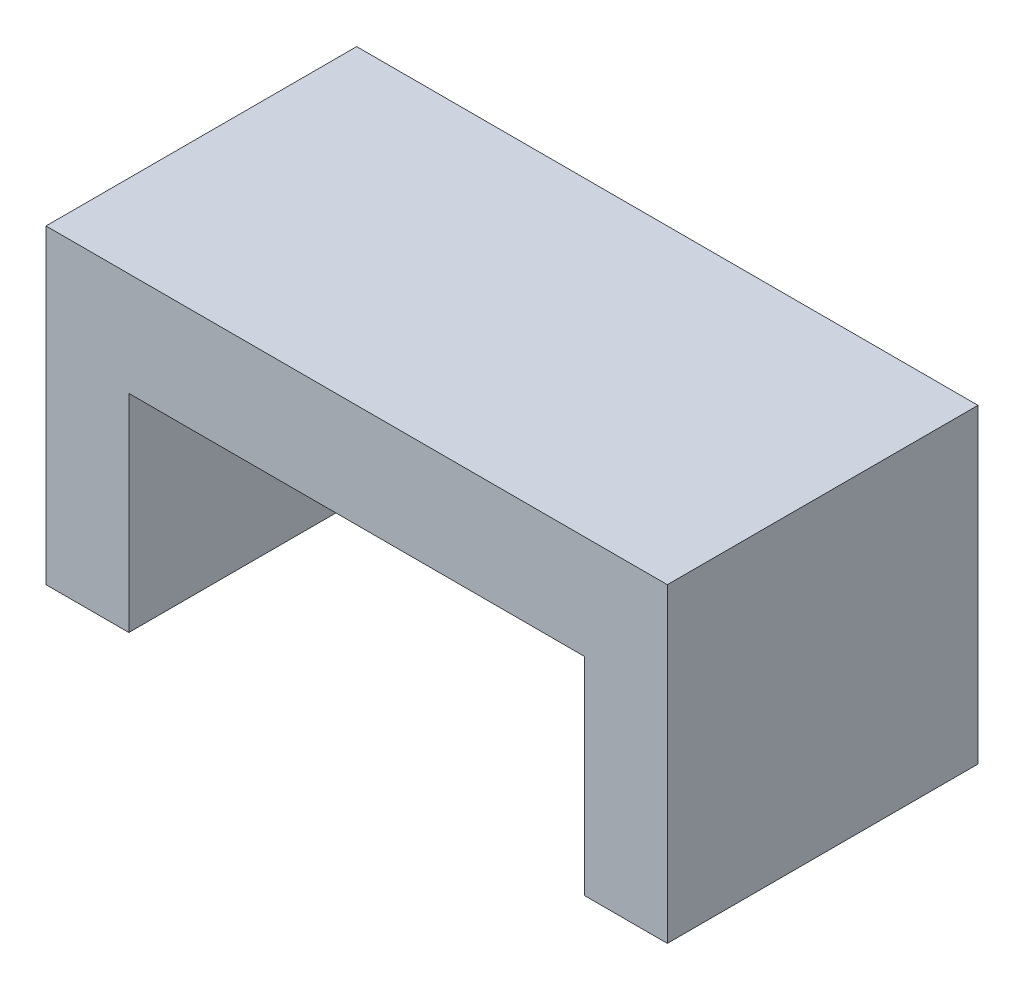
ISO-10303-21;
HEADER;
FILE_DESCRIPTION(('STEP AP214'),'2;1');
FILE_NAME('part.step','',(''),(''),'','','');
FILE_SCHEMA(('AUTOMOTIVE_DESIGN { 1 0 10303 214 1 1 1 1 }'));
ENDSEC;
DATA;
#1=APPLICATION_CONTEXT('core data for automotive mechanical design processes');
#2=APPLICATION_PROTOCOL_DEFINITION('international standard','automotive_design',2000,#1);
#3=PRODUCT_CONTEXT('',#1,'mechanical');
#4=PRODUCT('Part','Part','',(#3));
#5=PRODUCT_RELATED_PRODUCT_CATEGORY('part','',(#4));
#6=PRODUCT_DEFINITION_FORMATION('','',#4);
#7=PRODUCT_DEFINITION_CONTEXT('part definition',#1,'design');
#8=PRODUCT_DEFINITION('design','',#6,#7);
#9=PRODUCT_DEFINITION_SHAPE('','',#8);
#10=(LENGTH_UNIT() NAMED_UNIT(*) SI_UNIT(.MILLI.,.METRE.));
#11=(NAMED_UNIT(*) PLANE_ANGLE_UNIT() SI_UNIT($,.RADIAN.));
#12=(NAMED_UNIT(*) SI_UNIT($,.STERADIAN.) SOLID_ANGLE_UNIT());
#13=UNCERTAINTY_MEASURE_WITH_UNIT(LENGTH_MEASURE(1.E-05),#10,'distance_accuracy_value','');
#14=(GEOMETRIC_REPRESENTATION_CONTEXT(3) GLOBAL_UNCERTAINTY_ASSIGNED_CONTEXT((#13)) GLOBAL_UNIT_ASSIGNED_CONTEXT((#10,
#11,#12)) REPRESENTATION_CONTEXT('',''));
#15=CARTESIAN_POINT('',(0.,0.,0.));
#16=DIRECTION('',(0.,0.,1.));
#17=DIRECTION('',(1.,0.,0.));
#18=AXIS2_PLACEMENT_3D('',#15,#16,#17);
#19=CARTESIAN_POINT('',(11.,-10.,7.5));
#20=DIRECTION('',(-1.,0.,0.));
#21=DIRECTION('',(0.,0.,1.));
#22=AXIS2_PLACEMENT_3D('',#19,#20,#21);
#23=PLANE('',#22);
#24=DIRECTION('',(0.,0.,1.));
#25=VECTOR('',#24,1.);
#26=CARTESIAN_POINT('',(11.,0.,7.5));
#27=LINE('',#26,#25);
#28=CARTESIAN_POINT('',(11.,0.,-7.5));
#29=VERTEX_POINT('',#28);
#30=CARTESIAN_POINT('',(11.,0.,7.5));
#31=VERTEX_POINT('',#30);
#32=EDGE_CURVE('E110',#29,#31,#27,.T.);
#33=ORIENTED_EDGE('',*,*,#32,.F.);
#34=DIRECTION('',(0.,1.,0.));
#35=VECTOR('',#34,1.);
#36=CARTESIAN_POINT('',(11.,-10.,-7.5));
#37=LINE('',#36,#35);
#38=CARTESIAN_POINT('',(11.,-10.,-7.5));
#39=VERTEX_POINT('',#38);
#40=EDGE_CURVE('E11',#39,#29,#37,.T.);
#41=ORIENTED_EDGE('',*,*,#40,.F.);
#42=DIRECTION('',(0.,0.,1.));
#43=VECTOR('',#42,1.);
#44=CARTESIAN_POINT('',(11.,-10.,7.5));
#45=LINE('',#44,#43);
#46=CARTESIAN_POINT('',(11.,-10.,7.5));
#47=VERTEX_POINT('',#46);
#48=EDGE_CURVE('E108',#39,#47,#45,.T.);
#49=ORIENTED_EDGE('',*,*,#48,.T.);
#50=DIRECTION('',(0.,1.,0.));
#51=VECTOR('',#50,1.);
#52=CARTESIAN_POINT('',(11.,-10.,7.5));
#53=LINE('',#52,#51);
#54=EDGE_CURVE('E36',#47,#31,#53,.T.);
#55=ORIENTED_EDGE('',*,*,#54,.T.);
#56=EDGE_LOOP('',(#33,#41,#49,#55));
#57=FACE_BOUND('',#56,.T.);
#58=ADVANCED_FACE('F33',(#57),#23,.T.);
#59=CARTESIAN_POINT('',(11.,-10.,-7.5));
#60=DIRECTION('',(0.,0.,-1.));
#61=DIRECTION('',(-1.,0.,0.));
#62=AXIS2_PLACEMENT_3D('',#59,#60,#61);
#63=PLANE('',#62);
#64=ORIENTED_EDGE('',*,*,#40,.T.);
#65=DIRECTION('',(1.,0.,0.));
#66=VECTOR('',#65,1.);
#67=CARTESIAN_POINT('',(-15.,0.,-7.5));
#68=LINE('',#67,#66);
#69=CARTESIAN_POINT('',(-11.,0.,-7.5));
#70=VERTEX_POINT('',#69);
#71=EDGE_CURVE('E69',#70,#29,#68,.T.);
#72=ORIENTED_EDGE('',*,*,#71,.F.);
#73=DIRECTION('',(0.,1.,0.));
#74=VECTOR('',#73,1.);
#75=CARTESIAN_POINT('',(-11.,-10.,-7.5));
#76=LINE('',#75,#74);
#77=CARTESIAN_POINT('',(-11.,-10.,-7.5));
#78=VERTEX_POINT('',#77);
#79=EDGE_CURVE('E148',#78,#70,#76,.T.);
#80=ORIENTED_EDGE('',*,*,#79,.F.);
#81=DIRECTION('',(-1.,0.,0.));
#82=VECTOR('',#81,1.);
#83=CARTESIAN_POINT('',(-11.,-10.,-7.5));
#84=LINE('',#83,#82);
#85=CARTESIAN_POINT('',(-15.,-10.,-7.49999999999999));
#86=VERTEX_POINT('',#85);
#87=EDGE_CURVE('E161',#78,#86,#84,.T.);
#88=ORIENTED_EDGE('',*,*,#87,.T.);
#89=DIRECTION('',(0.,-1.,0.));
#90=VECTOR('',#89,1.);
#91=CARTESIAN_POINT('',(-15.,0.,-7.5));
#92=LINE('',#91,#90);
#93=CARTESIAN_POINT('',(-15.,5.,-7.5));
#94=VERTEX_POINT('',#93);
#95=EDGE_CURVE('E130',#94,#86,#92,.T.);
#96=ORIENTED_EDGE('',*,*,#95,.F.);
#97=DIRECTION('',(-1.,0.,0.));
#98=VECTOR('',#97,1.);
#99=CARTESIAN_POINT('',(-15.,5.,-7.5));
#100=LINE('',#99,#98);
#101=CARTESIAN_POINT('',(15.,5.,-7.5));
#102=VERTEX_POINT('',#101);
#103=EDGE_CURVE('E124',#102,#94,#100,.T.);
#104=ORIENTED_EDGE('',*,*,#103,.F.);
#105=DIRECTION('',(0.,1.,0.));
#106=VECTOR('',#105,1.);
#107=CARTESIAN_POINT('',(15.,-10.,-7.49999999999999));
#108=LINE('',#107,#106);
#109=CARTESIAN_POINT('',(15.,-10.,-7.49999999999999));
#110=VERTEX_POINT('',#109);
#111=EDGE_CURVE('E41',#110,#102,#108,.T.);
#112=ORIENTED_EDGE('',*,*,#111,.F.);
#113=DIRECTION('',(-1.,0.,0.));
#114=VECTOR('',#113,1.);
#115=CARTESIAN_POINT('',(11.,-10.,-7.5));
#116=LINE('',#115,#114);
#117=EDGE_CURVE('E105',#110,#39,#116,.T.);
#118=ORIENTED_EDGE('',*,*,#117,.T.);
#119=EDGE_LOOP('',(#64,#72,#80,#88,#96,#104,#112,#118));
#120=FACE_BOUND('',#119,.T.);
#121=ADVANCED_FACE('F127',(#120),#63,.T.);
#122=CARTESIAN_POINT('',(15.,-10.,7.5));
#123=DIRECTION('',(1.,0.,0.));
#124=DIRECTION('',(0.,0.,-1.));
#125=AXIS2_PLACEMENT_3D('',#122,#123,#124);
#126=PLANE('',#125);
#127=ORIENTED_EDGE('',*,*,#111,.T.);
#128=DIRECTION('',(0.,0.,1.));
#129=VECTOR('',#128,1.);
#130=CARTESIAN_POINT('',(15.,5.,-7.5));
#131=LINE('',#130,#129);
#132=CARTESIAN_POINT('',(15.,5.,7.5));
#133=VERTEX_POINT('',#132);
#134=EDGE_CURVE('E96',#102,#133,#131,.T.);
#135=ORIENTED_EDGE('',*,*,#134,.T.);
#136=DIRECTION('',(0.,1.,0.));
#137=VECTOR('',#136,1.);
#138=CARTESIAN_POINT('',(15.,-10.,7.5));
#139=LINE('',#138,#137);
#140=CARTESIAN_POINT('',(15.,-10.,7.5));
#141=VERTEX_POINT('',#140);
#142=EDGE_CURVE('E88',#141,#133,#139,.T.);
#143=ORIENTED_EDGE('',*,*,#142,.F.);
#144=DIRECTION('',(0.,0.,-1.));
#145=VECTOR('',#144,1.);
#146=CARTESIAN_POINT('',(15.,-10.,7.5));
#147=LINE('',#146,#145);
#148=EDGE_CURVE('E92',#141,#110,#147,.T.);
#149=ORIENTED_EDGE('',*,*,#148,.T.);
#150=EDGE_LOOP('',(#127,#135,#143,#149));
#151=FACE_BOUND('',#150,.T.);
#152=ADVANCED_FACE('F91',(#151),#126,.T.);
#153=CARTESIAN_POINT('',(11.,-10.,7.5));
#154=DIRECTION('',(0.,0.,1.));
#155=DIRECTION('',(1.,0.,0.));
#156=AXIS2_PLACEMENT_3D('',#153,#154,#155);
#157=PLANE('',#156);
#158=ORIENTED_EDGE('',*,*,#142,.T.);
#159=DIRECTION('',(-1.,0.,0.));
#160=VECTOR('',#159,1.);
#161=CARTESIAN_POINT('',(-15.,5.,7.5));
#162=LINE('',#161,#160);
#163=CARTESIAN_POINT('',(-15.,5.,7.5));
#164=VERTEX_POINT('',#163);
#165=EDGE_CURVE('E125',#133,#164,#162,.T.);
#166=ORIENTED_EDGE('',*,*,#165,.T.);
#167=DIRECTION('',(0.,-1.,0.));
#168=VECTOR('',#167,1.);
#169=CARTESIAN_POINT('',(-15.,0.,7.5));
#170=LINE('',#169,#168);
#171=CARTESIAN_POINT('',(-15.,-10.,7.5));
#172=VERTEX_POINT('',#171);
#173=EDGE_CURVE('E141',#164,#172,#170,.T.);
#174=ORIENTED_EDGE('',*,*,#173,.T.);
#175=DIRECTION('',(1.,0.,0.));
#176=VECTOR('',#175,1.);
#177=CARTESIAN_POINT('',(-11.,-10.,7.5));
#178=LINE('',#177,#176);
#179=CARTESIAN_POINT('',(-11.,-10.,7.5));
#180=VERTEX_POINT('',#179);
#181=EDGE_CURVE('E162',#172,#180,#178,.T.);
#182=ORIENTED_EDGE('',*,*,#181,.T.);
#183=DIRECTION('',(0.,1.,0.));
#184=VECTOR('',#183,1.);
#185=CARTESIAN_POINT('',(-11.,-10.,7.5));
#186=LINE('',#185,#184);
#187=CARTESIAN_POINT('',(-11.,0.,7.5));
#188=VERTEX_POINT('',#187);
#189=EDGE_CURVE('E151',#180,#188,#186,.T.);
#190=ORIENTED_EDGE('',*,*,#189,.T.);
#191=DIRECTION('',(1.,0.,0.));
#192=VECTOR('',#191,1.);
#193=CARTESIAN_POINT('',(-15.,0.,7.5));
#194=LINE('',#193,#192);
#195=EDGE_CURVE('E77',#188,#31,#194,.T.);
#196=ORIENTED_EDGE('',*,*,#195,.T.);
#197=ORIENTED_EDGE('',*,*,#54,.F.);
#198=DIRECTION('',(1.,0.,0.));
#199=VECTOR('',#198,1.);
#200=CARTESIAN_POINT('',(11.,-10.,7.5));
#201=LINE('',#200,#199);
#202=EDGE_CURVE('E103',#47,#141,#201,.T.);
#203=ORIENTED_EDGE('',*,*,#202,.T.);
#204=EDGE_LOOP('',(#158,#166,#174,#182,#190,#196,#197,#203));
#205=FACE_BOUND('',#204,.T.);
#206=ADVANCED_FACE('F107',(#205),#157,.T.);
#207=CARTESIAN_POINT('',(0.,-10.,0.));
#208=DIRECTION('',(0.,-1.,0.));
#209=DIRECTION('',(0.,0.,-1.));
#210=AXIS2_PLACEMENT_3D('',#207,#208,#209);
#211=PLANE('',#210);
#212=ORIENTED_EDGE('',*,*,#48,.F.);
#213=ORIENTED_EDGE('',*,*,#117,.F.);
#214=ORIENTED_EDGE('',*,*,#148,.F.);
#215=ORIENTED_EDGE('',*,*,#202,.F.);
#216=EDGE_LOOP('',(#212,#213,#214,#215));
#217=FACE_BOUND('',#216,.T.);
#218=ADVANCED_FACE('F102',(#217),#211,.T.);
#219=CARTESIAN_POINT('',(-15.,0.,-7.5));
#220=DIRECTION('',(-1.,0.,0.));
#221=DIRECTION('',(0.,-1.,0.));
#222=AXIS2_PLACEMENT_3D('',#219,#220,#221);
#223=PLANE('',#222);
#224=ORIENTED_EDGE('',*,*,#95,.T.);
#225=DIRECTION('',(0.,0.,1.));
#226=VECTOR('',#225,1.);
#227=CARTESIAN_POINT('',(-15.,-10.,7.5));
#228=LINE('',#227,#226);
#229=EDGE_CURVE('E147',#86,#172,#228,.T.);
#230=ORIENTED_EDGE('',*,*,#229,.T.);
#231=ORIENTED_EDGE('',*,*,#173,.F.);
#232=DIRECTION('',(0.,0.,1.));
#233=VECTOR('',#232,1.);
#234=CARTESIAN_POINT('',(-15.,5.,-7.5));
#235=LINE('',#234,#233);
#236=EDGE_CURVE('E115',#94,#164,#235,.T.);
#237=ORIENTED_EDGE('',*,*,#236,.F.);
#238=EDGE_LOOP('',(#224,#230,#231,#237));
#239=FACE_BOUND('',#238,.T.);
#240=ADVANCED_FACE('F145',(#239),#223,.T.);
#241=CARTESIAN_POINT('',(-15.,5.,-7.5));
#242=DIRECTION('',(0.,1.,0.));
#243=DIRECTION('',(0.,0.,1.));
#244=AXIS2_PLACEMENT_3D('',#241,#242,#243);
#245=PLANE('',#244);
#246=ORIENTED_EDGE('',*,*,#236,.T.);
#247=ORIENTED_EDGE('',*,*,#165,.F.);
#248=ORIENTED_EDGE('',*,*,#134,.F.);
#249=ORIENTED_EDGE('',*,*,#103,.T.);
#250=EDGE_LOOP('',(#246,#247,#248,#249));
#251=FACE_BOUND('',#250,.T.);
#252=ADVANCED_FACE('F123',(#251),#245,.T.);
#253=CARTESIAN_POINT('',(-15.,0.,-7.5));
#254=DIRECTION('',(0.,-1.,0.));
#255=DIRECTION('',(0.,0.,-1.));
#256=AXIS2_PLACEMENT_3D('',#253,#254,#255);
#257=PLANE('',#256);
#258=DIRECTION('',(0.,0.,-1.));
#259=VECTOR('',#258,1.);
#260=CARTESIAN_POINT('',(-11.,0.,7.5));
#261=LINE('',#260,#259);
#262=EDGE_CURVE('E49',#188,#70,#261,.T.);
#263=ORIENTED_EDGE('',*,*,#262,.T.);
#264=ORIENTED_EDGE('',*,*,#71,.T.);
#265=ORIENTED_EDGE('',*,*,#32,.T.);
#266=ORIENTED_EDGE('',*,*,#195,.F.);
#267=EDGE_LOOP('',(#263,#264,#265,#266));
#268=FACE_BOUND('',#267,.T.);
#269=ADVANCED_FACE('F172',(#268),#257,.T.);
#270=CARTESIAN_POINT('',(-11.,-10.,7.5));
#271=DIRECTION('',(1.,0.,0.));
#272=DIRECTION('',(0.,0.,-1.));
#273=AXIS2_PLACEMENT_3D('',#270,#271,#272);
#274=PLANE('',#273);
#275=ORIENTED_EDGE('',*,*,#262,.F.);
#276=ORIENTED_EDGE('',*,*,#189,.F.);
#277=DIRECTION('',(0.,0.,-1.));
#278=VECTOR('',#277,1.);
#279=CARTESIAN_POINT('',(-11.,-10.,7.5));
#280=LINE('',#279,#278);
#281=EDGE_CURVE('E166',#180,#78,#280,.T.);
#282=ORIENTED_EDGE('',*,*,#281,.T.);
#283=ORIENTED_EDGE('',*,*,#79,.T.);
#284=EDGE_LOOP('',(#275,#276,#282,#283));
#285=FACE_BOUND('',#284,.T.);
#286=ADVANCED_FACE('F198',(#285),#274,.T.);
#287=CARTESIAN_POINT('',(0.,-10.,0.));
#288=DIRECTION('',(0.,1.,0.));
#289=DIRECTION('',(0.,0.,1.));
#290=AXIS2_PLACEMENT_3D('',#287,#288,#289);
#291=PLANE('',#290);
#292=ORIENTED_EDGE('',*,*,#229,.F.);
#293=ORIENTED_EDGE('',*,*,#87,.F.);
#294=ORIENTED_EDGE('',*,*,#281,.F.);
#295=ORIENTED_EDGE('',*,*,#181,.F.);
#296=EDGE_LOOP('',(#292,#293,#294,#295));
#297=FACE_BOUND('',#296,.T.);
#298=ADVANCED_FACE('F159',(#297),#291,.F.);
#299=CLOSED_SHELL('',(#58,#121,#152,#206,#218,#240,#252,#269,#286,#298));
#300=MANIFOLD_SOLID_BREP('B2',#299);
#301=ADVANCED_BREP_SHAPE_REPRESENTATION('',(#18,#300),#14);
#302=SHAPE_DEFINITION_REPRESENTATION(#9,#301);
ENDSEC;
END-ISO-10303-21;
